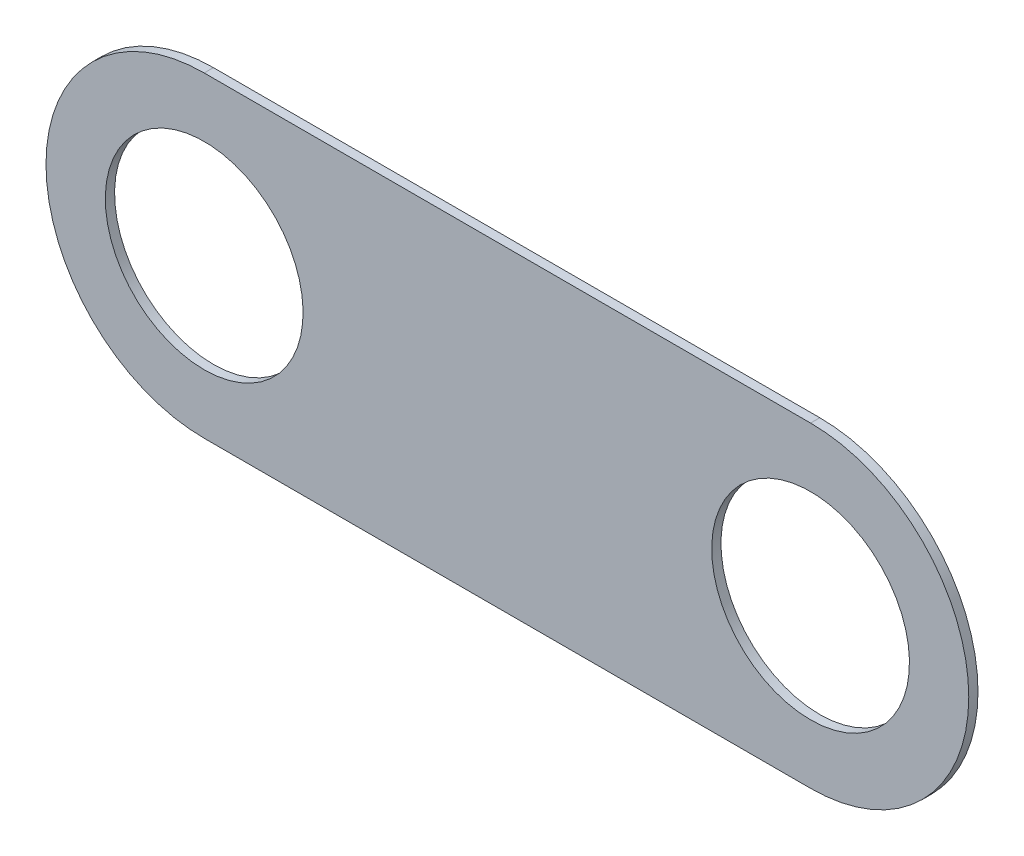
ISO-10303-21;
HEADER;
FILE_DESCRIPTION(('STEP AP214'),'2;1');
FILE_NAME('part.step','',(''),(''),'','','');
FILE_SCHEMA(('AUTOMOTIVE_DESIGN { 1 0 10303 214 1 1 1 1 }'));
ENDSEC;
DATA;
#1=APPLICATION_CONTEXT('core data for automotive mechanical design processes');
#2=APPLICATION_PROTOCOL_DEFINITION('international standard','automotive_design',2000,#1);
#3=PRODUCT_CONTEXT('',#1,'mechanical');
#4=PRODUCT('Part','Part','',(#3));
#5=PRODUCT_RELATED_PRODUCT_CATEGORY('part','',(#4));
#6=PRODUCT_DEFINITION_FORMATION('','',#4);
#7=PRODUCT_DEFINITION_CONTEXT('part definition',#1,'design');
#8=PRODUCT_DEFINITION('design','',#6,#7);
#9=PRODUCT_DEFINITION_SHAPE('','',#8);
#10=(LENGTH_UNIT() NAMED_UNIT(*) SI_UNIT(.MILLI.,.METRE.));
#11=(NAMED_UNIT(*) PLANE_ANGLE_UNIT() SI_UNIT($,.RADIAN.));
#12=(NAMED_UNIT(*) SI_UNIT($,.STERADIAN.) SOLID_ANGLE_UNIT());
#13=UNCERTAINTY_MEASURE_WITH_UNIT(LENGTH_MEASURE(1.E-05),#10,'distance_accuracy_value','');
#14=(GEOMETRIC_REPRESENTATION_CONTEXT(3) GLOBAL_UNCERTAINTY_ASSIGNED_CONTEXT((#13)) GLOBAL_UNIT_ASSIGNED_CONTEXT((#10,
#11,#12)) REPRESENTATION_CONTEXT('',''));
#15=CARTESIAN_POINT('',(0.,0.,0.));
#16=DIRECTION('',(0.,0.,1.));
#17=DIRECTION('',(1.,0.,0.));
#18=AXIS2_PLACEMENT_3D('',#15,#16,#17);
#19=CARTESIAN_POINT('',(8.05,9.13,-0.045));
#20=DIRECTION('',(0.,0.,-1.));
#21=DIRECTION('',(0.,-1.,0.));
#22=AXIS2_PLACEMENT_3D('',#19,#20,#21);
#23=CYLINDRICAL_SURFACE('',#22,0.375);
#24=CARTESIAN_POINT('',(8.05,9.13,1.6));
#25=DIRECTION('',(0.,0.,-1.));
#26=DIRECTION('',(0.,-1.,0.));
#27=AXIS2_PLACEMENT_3D('',#24,#25,#26);
#28=CIRCLE('',#27,0.375);
#29=CARTESIAN_POINT('',(8.05,8.755,1.6));
#30=VERTEX_POINT('',#29);
#31=EDGE_CURVE('E91',#30,#30,#28,.T.);
#32=ORIENTED_EDGE('',*,*,#31,.T.);
#33=DIRECTION('',(0.,0.,1.));
#34=VECTOR('',#33,1.);
#35=CARTESIAN_POINT('',(8.05,8.755,-0.045));
#36=LINE('',#35,#34);
#37=CARTESIAN_POINT('',(8.05,8.755,1.635));
#38=VERTEX_POINT('',#37);
#39=EDGE_CURVE('E11',#30,#38,#36,.T.);
#40=ORIENTED_EDGE('',*,*,#39,.T.);
#41=CARTESIAN_POINT('',(8.05,9.13,1.635));
#42=DIRECTION('',(0.,0.,-1.));
#43=DIRECTION('',(0.,-1.,0.));
#44=AXIS2_PLACEMENT_3D('',#41,#42,#43);
#45=CIRCLE('',#44,0.375);
#46=EDGE_CURVE('E92',#38,#38,#45,.T.);
#47=ORIENTED_EDGE('',*,*,#46,.F.);
#48=ORIENTED_EDGE('',*,*,#39,.F.);
#49=EDGE_LOOP('',(#32,#40,#47,#48));
#50=FACE_BOUND('',#49,.T.);
#51=ADVANCED_FACE('F16',(#50),#23,.F.);
#52=CARTESIAN_POINT('',(5.75,9.13,-0.045));
#53=DIRECTION('',(0.,0.,-1.));
#54=DIRECTION('',(0.,-1.,0.));
#55=AXIS2_PLACEMENT_3D('',#52,#53,#54);
#56=CYLINDRICAL_SURFACE('',#55,0.375);
#57=CARTESIAN_POINT('',(5.75,9.13,1.6));
#58=DIRECTION('',(0.,0.,-1.));
#59=DIRECTION('',(0.,-1.,0.));
#60=AXIS2_PLACEMENT_3D('',#57,#58,#59);
#61=CIRCLE('',#60,0.375);
#62=CARTESIAN_POINT('',(5.75,8.755,1.6));
#63=VERTEX_POINT('',#62);
#64=EDGE_CURVE('E123',#63,#63,#61,.T.);
#65=ORIENTED_EDGE('',*,*,#64,.T.);
#66=DIRECTION('',(0.,0.,1.));
#67=VECTOR('',#66,1.);
#68=CARTESIAN_POINT('',(5.75,8.755,-0.045));
#69=LINE('',#68,#67);
#70=CARTESIAN_POINT('',(5.75,8.755,1.635));
#71=VERTEX_POINT('',#70);
#72=EDGE_CURVE('E27',#63,#71,#69,.T.);
#73=ORIENTED_EDGE('',*,*,#72,.T.);
#74=CARTESIAN_POINT('',(5.75,9.13,1.635));
#75=DIRECTION('',(0.,0.,-1.));
#76=DIRECTION('',(0.,-1.,0.));
#77=AXIS2_PLACEMENT_3D('',#74,#75,#76);
#78=CIRCLE('',#77,0.375);
#79=EDGE_CURVE('E20',#71,#71,#78,.T.);
#80=ORIENTED_EDGE('',*,*,#79,.F.);
#81=ORIENTED_EDGE('',*,*,#72,.F.);
#82=EDGE_LOOP('',(#65,#73,#80,#81));
#83=FACE_BOUND('',#82,.T.);
#84=ADVANCED_FACE('F174',(#83),#56,.F.);
#85=CARTESIAN_POINT('',(5.75,8.53,1.6));
#86=DIRECTION('',(0.,1.,0.));
#87=DIRECTION('',(1.,0.,0.));
#88=AXIS2_PLACEMENT_3D('',#85,#86,#87);
#89=PLANE('',#88);
#90=DIRECTION('',(1.,0.,0.));
#91=VECTOR('',#90,1.);
#92=CARTESIAN_POINT('',(5.75,8.53,1.6));
#93=LINE('',#92,#91);
#94=CARTESIAN_POINT('',(5.75,8.53,1.6));
#95=VERTEX_POINT('',#94);
#96=CARTESIAN_POINT('',(8.05,8.53,1.6));
#97=VERTEX_POINT('',#96);
#98=EDGE_CURVE('E119',#95,#97,#93,.T.);
#99=ORIENTED_EDGE('',*,*,#98,.T.);
#100=DIRECTION('',(0.,0.,1.));
#101=VECTOR('',#100,1.);
#102=CARTESIAN_POINT('',(8.05,8.53,1.6));
#103=LINE('',#102,#101);
#104=CARTESIAN_POINT('',(8.05,8.53,1.635));
#105=VERTEX_POINT('',#104);
#106=EDGE_CURVE('E113',#97,#105,#103,.T.);
#107=ORIENTED_EDGE('',*,*,#106,.T.);
#108=DIRECTION('',(1.,0.,0.));
#109=VECTOR('',#108,1.);
#110=CARTESIAN_POINT('',(5.75,8.53,1.635));
#111=LINE('',#110,#109);
#112=CARTESIAN_POINT('',(5.75,8.53,1.635));
#113=VERTEX_POINT('',#112);
#114=EDGE_CURVE('E103',#113,#105,#111,.T.);
#115=ORIENTED_EDGE('',*,*,#114,.F.);
#116=DIRECTION('',(0.,0.,1.));
#117=VECTOR('',#116,1.);
#118=CARTESIAN_POINT('',(5.75,8.53,1.6));
#119=LINE('',#118,#117);
#120=EDGE_CURVE('E106',#95,#113,#119,.T.);
#121=ORIENTED_EDGE('',*,*,#120,.F.);
#122=EDGE_LOOP('',(#99,#107,#115,#121));
#123=FACE_BOUND('',#122,.T.);
#124=ADVANCED_FACE('F155',(#123),#89,.F.);
#125=CARTESIAN_POINT('',(8.05,9.73,1.635));
#126=DIRECTION('',(0.,0.,1.));
#127=DIRECTION('',(1.,0.,0.));
#128=AXIS2_PLACEMENT_3D('',#125,#126,#127);
#129=PLANE('',#128);
#130=ORIENTED_EDGE('',*,*,#46,.T.);
#131=EDGE_LOOP('',(#130));
#132=FACE_BOUND('',#131,.T.);
#133=ORIENTED_EDGE('',*,*,#79,.T.);
#134=EDGE_LOOP('',(#133));
#135=FACE_BOUND('',#134,.T.);
#136=DIRECTION('',(-1.,0.,0.));
#137=VECTOR('',#136,1.);
#138=CARTESIAN_POINT('',(8.05,9.73,1.635));
#139=LINE('',#138,#137);
#140=CARTESIAN_POINT('',(8.05,9.73,1.635));
#141=VERTEX_POINT('',#140);
#142=CARTESIAN_POINT('',(5.75,9.73,1.635));
#143=VERTEX_POINT('',#142);
#144=EDGE_CURVE('E124',#141,#143,#139,.T.);
#145=ORIENTED_EDGE('',*,*,#144,.T.);
#146=CARTESIAN_POINT('',(5.75,9.13,1.635));
#147=DIRECTION('',(0.,0.,1.));
#148=DIRECTION('',(0.,1.,0.));
#149=AXIS2_PLACEMENT_3D('',#146,#147,#148);
#150=CIRCLE('',#149,0.6);
#151=EDGE_CURVE('E110',#143,#113,#150,.T.);
#152=ORIENTED_EDGE('',*,*,#151,.T.);
#153=ORIENTED_EDGE('',*,*,#114,.T.);
#154=CARTESIAN_POINT('',(8.05,9.13,1.635));
#155=DIRECTION('',(0.,0.,1.));
#156=DIRECTION('',(0.,-1.,0.));
#157=AXIS2_PLACEMENT_3D('',#154,#155,#156);
#158=CIRCLE('',#157,0.6);
#159=EDGE_CURVE('E136',#105,#141,#158,.T.);
#160=ORIENTED_EDGE('',*,*,#159,.T.);
#161=EDGE_LOOP('',(#145,#152,#153,#160));
#162=FACE_BOUND('',#161,.T.);
#163=ADVANCED_FACE('F150',(#132,#135,#162),#129,.T.);
#164=CARTESIAN_POINT('',(8.05,9.73,1.6));
#165=DIRECTION('',(0.,0.,1.));
#166=DIRECTION('',(1.,0.,0.));
#167=AXIS2_PLACEMENT_3D('',#164,#165,#166);
#168=PLANE('',#167);
#169=ORIENTED_EDGE('',*,*,#31,.F.);
#170=EDGE_LOOP('',(#169));
#171=FACE_BOUND('',#170,.T.);
#172=ORIENTED_EDGE('',*,*,#64,.F.);
#173=EDGE_LOOP('',(#172));
#174=FACE_BOUND('',#173,.T.);
#175=CARTESIAN_POINT('',(8.05,9.13,1.6));
#176=DIRECTION('',(0.,0.,1.));
#177=DIRECTION('',(0.,-1.,0.));
#178=AXIS2_PLACEMENT_3D('',#175,#176,#177);
#179=CIRCLE('',#178,0.6);
#180=CARTESIAN_POINT('',(8.05,9.73,1.6));
#181=VERTEX_POINT('',#180);
#182=EDGE_CURVE('E70',#97,#181,#179,.T.);
#183=ORIENTED_EDGE('',*,*,#182,.F.);
#184=ORIENTED_EDGE('',*,*,#98,.F.);
#185=CARTESIAN_POINT('',(5.75,9.13,1.6));
#186=DIRECTION('',(0.,0.,1.));
#187=DIRECTION('',(0.,1.,0.));
#188=AXIS2_PLACEMENT_3D('',#185,#186,#187);
#189=CIRCLE('',#188,0.6);
#190=CARTESIAN_POINT('',(5.75,9.73,1.6));
#191=VERTEX_POINT('',#190);
#192=EDGE_CURVE('E58',#191,#95,#189,.T.);
#193=ORIENTED_EDGE('',*,*,#192,.F.);
#194=DIRECTION('',(-1.,0.,0.));
#195=VECTOR('',#194,1.);
#196=CARTESIAN_POINT('',(8.05,9.73,1.6));
#197=LINE('',#196,#195);
#198=EDGE_CURVE('E114',#181,#191,#197,.T.);
#199=ORIENTED_EDGE('',*,*,#198,.F.);
#200=EDGE_LOOP('',(#183,#184,#193,#199));
#201=FACE_BOUND('',#200,.T.);
#202=ADVANCED_FACE('F164',(#171,#174,#201),#168,.F.);
#203=CARTESIAN_POINT('',(5.75,9.13,1.6));
#204=DIRECTION('',(0.,0.,-1.));
#205=DIRECTION('',(0.,1.,0.));
#206=AXIS2_PLACEMENT_3D('',#203,#204,#205);
#207=CYLINDRICAL_SURFACE('',#206,0.6);
#208=ORIENTED_EDGE('',*,*,#192,.T.);
#209=ORIENTED_EDGE('',*,*,#120,.T.);
#210=ORIENTED_EDGE('',*,*,#151,.F.);
#211=DIRECTION('',(0.,0.,1.));
#212=VECTOR('',#211,1.);
#213=CARTESIAN_POINT('',(5.75,9.73,1.6));
#214=LINE('',#213,#212);
#215=EDGE_CURVE('E118',#191,#143,#214,.T.);
#216=ORIENTED_EDGE('',*,*,#215,.F.);
#217=EDGE_LOOP('',(#208,#209,#210,#216));
#218=FACE_BOUND('',#217,.T.);
#219=ADVANCED_FACE('F162',(#218),#207,.T.);
#220=CARTESIAN_POINT('',(8.05,9.13,1.6));
#221=DIRECTION('',(0.,0.,-1.));
#222=DIRECTION('',(0.,-1.,0.));
#223=AXIS2_PLACEMENT_3D('',#220,#221,#222);
#224=CYLINDRICAL_SURFACE('',#223,0.6);
#225=ORIENTED_EDGE('',*,*,#182,.T.);
#226=DIRECTION('',(0.,0.,1.));
#227=VECTOR('',#226,1.);
#228=CARTESIAN_POINT('',(8.05,9.73,1.6));
#229=LINE('',#228,#227);
#230=EDGE_CURVE('E128',#181,#141,#229,.T.);
#231=ORIENTED_EDGE('',*,*,#230,.T.);
#232=ORIENTED_EDGE('',*,*,#159,.F.);
#233=ORIENTED_EDGE('',*,*,#106,.F.);
#234=EDGE_LOOP('',(#225,#231,#232,#233));
#235=FACE_BOUND('',#234,.T.);
#236=ADVANCED_FACE('F18',(#235),#224,.T.);
#237=CARTESIAN_POINT('',(8.05,9.73,1.6));
#238=DIRECTION('',(0.,-1.,0.));
#239=DIRECTION('',(0.,0.,-1.));
#240=AXIS2_PLACEMENT_3D('',#237,#238,#239);
#241=PLANE('',#240);
#242=ORIENTED_EDGE('',*,*,#198,.T.);
#243=ORIENTED_EDGE('',*,*,#215,.T.);
#244=ORIENTED_EDGE('',*,*,#144,.F.);
#245=ORIENTED_EDGE('',*,*,#230,.F.);
#246=EDGE_LOOP('',(#242,#243,#244,#245));
#247=FACE_BOUND('',#246,.T.);
#248=ADVANCED_FACE('F160',(#247),#241,.F.);
#249=CLOSED_SHELL('',(#51,#84,#124,#163,#202,#219,#236,#248));
#250=MANIFOLD_SOLID_BREP('B1',#249);
#251=ADVANCED_BREP_SHAPE_REPRESENTATION('',(#18,#250),#14);
#252=SHAPE_DEFINITION_REPRESENTATION(#9,#251);
ENDSEC;
END-ISO-10303-21;
